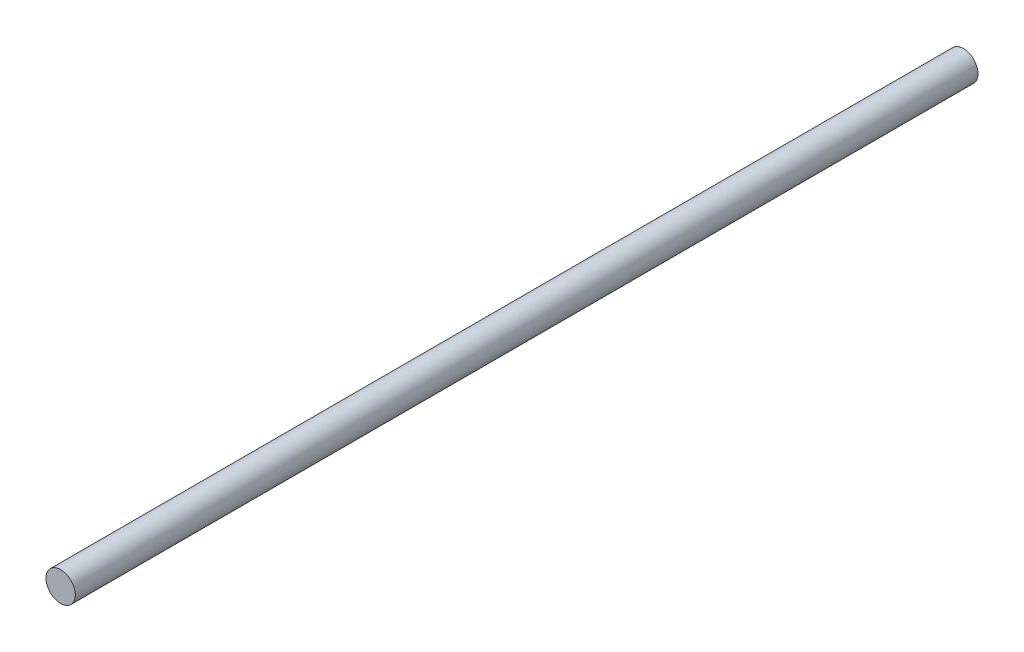
ISO-10303-21;
HEADER;
FILE_DESCRIPTION(('STEP AP214'),'2;1');
FILE_NAME('part.step','',(''),(''),'','','');
FILE_SCHEMA(('AUTOMOTIVE_DESIGN { 1 0 10303 214 1 1 1 1 }'));
ENDSEC;
DATA;
#1=APPLICATION_CONTEXT('core data for automotive mechanical design processes');
#2=APPLICATION_PROTOCOL_DEFINITION('international standard','automotive_design',2000,#1);
#3=PRODUCT_CONTEXT('',#1,'mechanical');
#4=PRODUCT('Part','Part','',(#3));
#5=PRODUCT_RELATED_PRODUCT_CATEGORY('part','',(#4));
#6=PRODUCT_DEFINITION_FORMATION('','',#4);
#7=PRODUCT_DEFINITION_CONTEXT('part definition',#1,'design');
#8=PRODUCT_DEFINITION('design','',#6,#7);
#9=PRODUCT_DEFINITION_SHAPE('','',#8);
#10=(LENGTH_UNIT() NAMED_UNIT(*) SI_UNIT(.MILLI.,.METRE.));
#11=(NAMED_UNIT(*) PLANE_ANGLE_UNIT() SI_UNIT($,.RADIAN.));
#12=(NAMED_UNIT(*) SI_UNIT($,.STERADIAN.) SOLID_ANGLE_UNIT());
#13=UNCERTAINTY_MEASURE_WITH_UNIT(LENGTH_MEASURE(1.E-05),#10,'distance_accuracy_value','');
#14=(GEOMETRIC_REPRESENTATION_CONTEXT(3) GLOBAL_UNCERTAINTY_ASSIGNED_CONTEXT((#13)) GLOBAL_UNIT_ASSIGNED_CONTEXT((#10,
#11,#12)) REPRESENTATION_CONTEXT('',''));
#15=CARTESIAN_POINT('',(0.,0.,0.));
#16=DIRECTION('',(0.,0.,1.));
#17=DIRECTION('',(1.,0.,0.));
#18=AXIS2_PLACEMENT_3D('',#15,#16,#17);
#19=CARTESIAN_POINT('',(3.94723839735502,-0.768672740537558,200.));
#20=DIRECTION('',(0.,0.,-1.));
#21=DIRECTION('',(-1.,0.,0.));
#22=AXIS2_PLACEMENT_3D('',#19,#20,#21);
#23=CYLINDRICAL_SURFACE('',#22,3.25);
#24=CARTESIAN_POINT('',(3.94723839735502,-0.768672740537558,200.));
#25=DIRECTION('',(0.,0.,1.));
#26=DIRECTION('',(1.,0.,0.));
#27=AXIS2_PLACEMENT_3D('',#24,#25,#26);
#28=CIRCLE('',#27,3.25);
#29=CARTESIAN_POINT('',(7.19723839735502,-0.768672740537558,200.));
#30=VERTEX_POINT('',#29);
#31=EDGE_CURVE('E10',#30,#30,#28,.T.);
#32=ORIENTED_EDGE('',*,*,#31,.F.);
#33=EDGE_LOOP('',(#32));
#34=FACE_BOUND('',#33,.T.);
#35=CARTESIAN_POINT('',(3.94723839735502,-0.768672740537558,0.));
#36=DIRECTION('',(0.,0.,1.));
#37=DIRECTION('',(1.,0.,0.));
#38=AXIS2_PLACEMENT_3D('',#35,#36,#37);
#39=CIRCLE('',#38,3.25);
#40=CARTESIAN_POINT('',(7.19723839735502,-0.768672740537558,0.));
#41=VERTEX_POINT('',#40);
#42=EDGE_CURVE('E37',#41,#41,#39,.T.);
#43=ORIENTED_EDGE('',*,*,#42,.T.);
#44=EDGE_LOOP('',(#43));
#45=FACE_BOUND('',#44,.T.);
#46=ADVANCED_FACE('F34',(#34,#45),#23,.T.);
#47=CARTESIAN_POINT('',(3.94723839735502,-0.768672740537558,200.));
#48=DIRECTION('',(0.,0.,1.));
#49=DIRECTION('',(1.,0.,0.));
#50=AXIS2_PLACEMENT_3D('',#47,#48,#49);
#51=PLANE('',#50);
#52=ORIENTED_EDGE('',*,*,#31,.T.);
#53=EDGE_LOOP('',(#52));
#54=FACE_BOUND('',#53,.T.);
#55=ADVANCED_FACE('F49',(#54),#51,.T.);
#56=CARTESIAN_POINT('',(3.94723839735502,-0.768672740537558,0.));
#57=DIRECTION('',(0.,0.,1.));
#58=DIRECTION('',(1.,0.,0.));
#59=AXIS2_PLACEMENT_3D('',#56,#57,#58);
#60=PLANE('',#59);
#61=ORIENTED_EDGE('',*,*,#42,.F.);
#62=EDGE_LOOP('',(#61));
#63=FACE_BOUND('',#62,.T.);
#64=ADVANCED_FACE('F47',(#63),#60,.F.);
#65=CLOSED_SHELL('',(#46,#55,#64));
#66=MANIFOLD_SOLID_BREP('B2',#65);
#67=ADVANCED_BREP_SHAPE_REPRESENTATION('',(#18,#66),#14);
#68=SHAPE_DEFINITION_REPRESENTATION(#9,#67);
ENDSEC;
END-ISO-10303-21;
